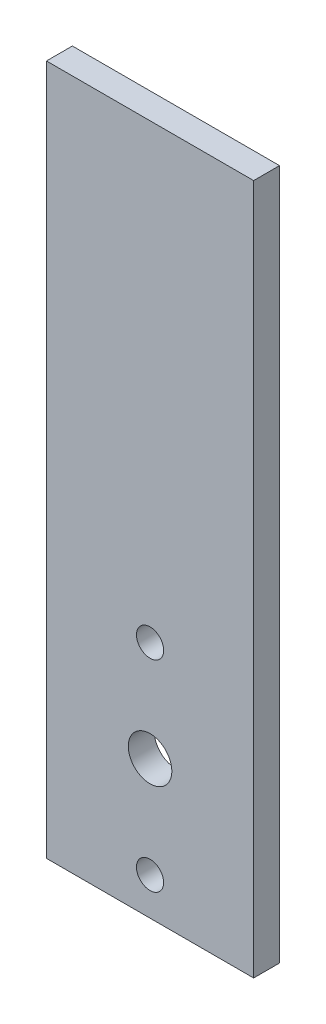
ISO-10303-21;
HEADER;
FILE_DESCRIPTION(('STEP AP214'),'2;1');
FILE_NAME('part.step','',(''),(''),'','','');
FILE_SCHEMA(('AUTOMOTIVE_DESIGN { 1 0 10303 214 1 1 1 1 }'));
ENDSEC;
DATA;
#1=APPLICATION_CONTEXT('core data for automotive mechanical design processes');
#2=APPLICATION_PROTOCOL_DEFINITION('international standard','automotive_design',2000,#1);
#3=PRODUCT_CONTEXT('',#1,'mechanical');
#4=PRODUCT('Part','Part','',(#3));
#5=PRODUCT_RELATED_PRODUCT_CATEGORY('part','',(#4));
#6=PRODUCT_DEFINITION_FORMATION('','',#4);
#7=PRODUCT_DEFINITION_CONTEXT('part definition',#1,'design');
#8=PRODUCT_DEFINITION('design','',#6,#7);
#9=PRODUCT_DEFINITION_SHAPE('','',#8);
#10=(LENGTH_UNIT() NAMED_UNIT(*) SI_UNIT(.MILLI.,.METRE.));
#11=(NAMED_UNIT(*) PLANE_ANGLE_UNIT() SI_UNIT($,.RADIAN.));
#12=(NAMED_UNIT(*) SI_UNIT($,.STERADIAN.) SOLID_ANGLE_UNIT());
#13=UNCERTAINTY_MEASURE_WITH_UNIT(LENGTH_MEASURE(1.E-05),#10,'distance_accuracy_value','');
#14=(GEOMETRIC_REPRESENTATION_CONTEXT(3) GLOBAL_UNCERTAINTY_ASSIGNED_CONTEXT((#13)) GLOBAL_UNIT_ASSIGNED_CONTEXT((#10,
#11,#12)) REPRESENTATION_CONTEXT('',''));
#15=CARTESIAN_POINT('',(0.,0.,0.));
#16=DIRECTION('',(0.,0.,1.));
#17=DIRECTION('',(1.,0.,0.));
#18=AXIS2_PLACEMENT_3D('',#15,#16,#17);
#19=CARTESIAN_POINT('',(0.,0.,4.7625));
#20=DIRECTION('',(0.,0.,-1.));
#21=DIRECTION('',(-1.,0.,0.));
#22=AXIS2_PLACEMENT_3D('',#19,#20,#21);
#23=PLANE('',#22);
#24=DIRECTION('',(0.,-1.,0.));
#25=VECTOR('',#24,1.);
#26=CARTESIAN_POINT('',(0.,0.,4.7625));
#27=LINE('',#26,#25);
#28=CARTESIAN_POINT('',(0.,127.,4.7625));
#29=VERTEX_POINT('',#28);
#30=CARTESIAN_POINT('',(0.,0.,4.7625));
#31=VERTEX_POINT('',#30);
#32=EDGE_CURVE('E96',#29,#31,#27,.T.);
#33=ORIENTED_EDGE('',*,*,#32,.T.);
#34=DIRECTION('',(1.,0.,0.));
#35=VECTOR('',#34,1.);
#36=CARTESIAN_POINT('',(0.,0.,4.7625));
#37=LINE('',#36,#35);
#38=CARTESIAN_POINT('',(38.1,0.,4.7625));
#39=VERTEX_POINT('',#38);
#40=EDGE_CURVE('E91',#31,#39,#37,.T.);
#41=ORIENTED_EDGE('',*,*,#40,.T.);
#42=DIRECTION('',(0.,1.,0.));
#43=VECTOR('',#42,1.);
#44=CARTESIAN_POINT('',(38.1,0.,4.7625));
#45=LINE('',#44,#43);
#46=CARTESIAN_POINT('',(38.1,127.,4.7625));
#47=VERTEX_POINT('',#46);
#48=EDGE_CURVE('E94',#39,#47,#45,.T.);
#49=ORIENTED_EDGE('',*,*,#48,.T.);
#50=DIRECTION('',(-1.,0.,0.));
#51=VECTOR('',#50,1.);
#52=CARTESIAN_POINT('',(0.,127.,4.7625));
#53=LINE('',#52,#51);
#54=EDGE_CURVE('E61',#47,#29,#53,.T.);
#55=ORIENTED_EDGE('',*,*,#54,.T.);
#56=EDGE_LOOP('',(#33,#41,#49,#55));
#57=FACE_BOUND('',#56,.T.);
#58=CARTESIAN_POINT('',(19.05,25.4,4.7625));
#59=DIRECTION('',(0.,0.,1.));
#60=DIRECTION('',(1.,0.,0.));
#61=AXIS2_PLACEMENT_3D('',#58,#59,#60);
#62=CIRCLE('',#61,4.);
#63=CARTESIAN_POINT('',(15.05,25.4,4.7625));
#64=VERTEX_POINT('',#63);
#65=EDGE_CURVE('E116',#64,#64,#62,.T.);
#66=ORIENTED_EDGE('',*,*,#65,.F.);
#67=EDGE_LOOP('',(#66));
#68=FACE_BOUND('',#67,.T.);
#69=CARTESIAN_POINT('',(19.05,6.9,4.7625));
#70=DIRECTION('',(0.,0.,1.));
#71=DIRECTION('',(1.,0.,0.));
#72=AXIS2_PLACEMENT_3D('',#69,#70,#71);
#73=CIRCLE('',#72,2.5);
#74=CARTESIAN_POINT('',(16.55,6.9,4.7625));
#75=VERTEX_POINT('',#74);
#76=EDGE_CURVE('E138',#75,#75,#73,.T.);
#77=ORIENTED_EDGE('',*,*,#76,.F.);
#78=EDGE_LOOP('',(#77));
#79=FACE_BOUND('',#78,.T.);
#80=CARTESIAN_POINT('',(19.05,43.9,4.7625));
#81=DIRECTION('',(0.,0.,1.));
#82=DIRECTION('',(1.,0.,0.));
#83=AXIS2_PLACEMENT_3D('',#80,#81,#82);
#84=CIRCLE('',#83,2.5);
#85=CARTESIAN_POINT('',(16.55,43.9,4.7625));
#86=VERTEX_POINT('',#85);
#87=EDGE_CURVE('E146',#86,#86,#84,.T.);
#88=ORIENTED_EDGE('',*,*,#87,.F.);
#89=EDGE_LOOP('',(#88));
#90=FACE_BOUND('',#89,.T.);
#91=ADVANCED_FACE('F43',(#57,#68,#79,#90),#23,.F.);
#92=CARTESIAN_POINT('',(0.,0.,0.));
#93=DIRECTION('',(0.,0.,-1.));
#94=DIRECTION('',(-1.,0.,0.));
#95=AXIS2_PLACEMENT_3D('',#92,#93,#94);
#96=PLANE('',#95);
#97=CARTESIAN_POINT('',(19.05,6.9,0.));
#98=DIRECTION('',(0.,0.,1.));
#99=DIRECTION('',(1.,0.,0.));
#100=AXIS2_PLACEMENT_3D('',#97,#98,#99);
#101=CIRCLE('',#100,2.5);
#102=CARTESIAN_POINT('',(16.55,6.9,0.));
#103=VERTEX_POINT('',#102);
#104=EDGE_CURVE('E142',#103,#103,#101,.T.);
#105=ORIENTED_EDGE('',*,*,#104,.T.);
#106=EDGE_LOOP('',(#105));
#107=FACE_BOUND('',#106,.T.);
#108=DIRECTION('',(0.,-1.,0.));
#109=VECTOR('',#108,1.);
#110=CARTESIAN_POINT('',(0.,0.,0.));
#111=LINE('',#110,#109);
#112=CARTESIAN_POINT('',(0.,127.,0.));
#113=VERTEX_POINT('',#112);
#114=CARTESIAN_POINT('',(0.,0.,0.));
#115=VERTEX_POINT('',#114);
#116=EDGE_CURVE('E112',#113,#115,#111,.T.);
#117=ORIENTED_EDGE('',*,*,#116,.F.);
#118=DIRECTION('',(-1.,0.,0.));
#119=VECTOR('',#118,1.);
#120=CARTESIAN_POINT('',(0.,127.,0.));
#121=LINE('',#120,#119);
#122=CARTESIAN_POINT('',(38.1,127.,0.));
#123=VERTEX_POINT('',#122);
#124=EDGE_CURVE('E84',#123,#113,#121,.T.);
#125=ORIENTED_EDGE('',*,*,#124,.F.);
#126=DIRECTION('',(0.,1.,0.));
#127=VECTOR('',#126,1.);
#128=CARTESIAN_POINT('',(38.1,0.,0.));
#129=LINE('',#128,#127);
#130=CARTESIAN_POINT('',(38.1,0.,0.));
#131=VERTEX_POINT('',#130);
#132=EDGE_CURVE('E78',#131,#123,#129,.T.);
#133=ORIENTED_EDGE('',*,*,#132,.F.);
#134=DIRECTION('',(1.,0.,0.));
#135=VECTOR('',#134,1.);
#136=CARTESIAN_POINT('',(0.,0.,0.));
#137=LINE('',#136,#135);
#138=EDGE_CURVE('E101',#115,#131,#137,.T.);
#139=ORIENTED_EDGE('',*,*,#138,.F.);
#140=EDGE_LOOP('',(#117,#125,#133,#139));
#141=FACE_BOUND('',#140,.T.);
#142=CARTESIAN_POINT('',(19.05,25.4,0.));
#143=DIRECTION('',(0.,0.,1.));
#144=DIRECTION('',(1.,0.,0.));
#145=AXIS2_PLACEMENT_3D('',#142,#143,#144);
#146=CIRCLE('',#145,4.);
#147=CARTESIAN_POINT('',(15.05,25.4,0.));
#148=VERTEX_POINT('',#147);
#149=EDGE_CURVE('E134',#148,#148,#146,.T.);
#150=ORIENTED_EDGE('',*,*,#149,.T.);
#151=EDGE_LOOP('',(#150));
#152=FACE_BOUND('',#151,.T.);
#153=CARTESIAN_POINT('',(19.05,43.9,0.));
#154=DIRECTION('',(0.,0.,1.));
#155=DIRECTION('',(1.,0.,0.));
#156=AXIS2_PLACEMENT_3D('',#153,#154,#155);
#157=CIRCLE('',#156,2.5);
#158=CARTESIAN_POINT('',(16.55,43.9,0.));
#159=VERTEX_POINT('',#158);
#160=EDGE_CURVE('E150',#159,#159,#157,.T.);
#161=ORIENTED_EDGE('',*,*,#160,.T.);
#162=EDGE_LOOP('',(#161));
#163=FACE_BOUND('',#162,.T.);
#164=ADVANCED_FACE('F129',(#107,#141,#152,#163),#96,.T.);
#165=CARTESIAN_POINT('',(0.,0.,4.7625));
#166=DIRECTION('',(1.,0.,0.));
#167=DIRECTION('',(0.,0.,-1.));
#168=AXIS2_PLACEMENT_3D('',#165,#166,#167);
#169=PLANE('',#168);
#170=ORIENTED_EDGE('',*,*,#116,.T.);
#171=DIRECTION('',(0.,0.,-1.));
#172=VECTOR('',#171,1.);
#173=CARTESIAN_POINT('',(0.,0.,4.7625));
#174=LINE('',#173,#172);
#175=EDGE_CURVE('E11',#31,#115,#174,.T.);
#176=ORIENTED_EDGE('',*,*,#175,.F.);
#177=ORIENTED_EDGE('',*,*,#32,.F.);
#178=DIRECTION('',(0.,0.,-1.));
#179=VECTOR('',#178,1.);
#180=CARTESIAN_POINT('',(0.,127.,4.7625));
#181=LINE('',#180,#179);
#182=EDGE_CURVE('E108',#29,#113,#181,.T.);
#183=ORIENTED_EDGE('',*,*,#182,.T.);
#184=EDGE_LOOP('',(#170,#176,#177,#183));
#185=FACE_BOUND('',#184,.T.);
#186=ADVANCED_FACE('F45',(#185),#169,.F.);
#187=CARTESIAN_POINT('',(0.,0.,4.7625));
#188=DIRECTION('',(0.,1.,0.));
#189=DIRECTION('',(0.,0.,1.));
#190=AXIS2_PLACEMENT_3D('',#187,#188,#189);
#191=PLANE('',#190);
#192=ORIENTED_EDGE('',*,*,#138,.T.);
#193=DIRECTION('',(0.,0.,-1.));
#194=VECTOR('',#193,1.);
#195=CARTESIAN_POINT('',(38.1,0.,4.7625));
#196=LINE('',#195,#194);
#197=EDGE_CURVE('E53',#39,#131,#196,.T.);
#198=ORIENTED_EDGE('',*,*,#197,.F.);
#199=ORIENTED_EDGE('',*,*,#40,.F.);
#200=ORIENTED_EDGE('',*,*,#175,.T.);
#201=EDGE_LOOP('',(#192,#198,#199,#200));
#202=FACE_BOUND('',#201,.T.);
#203=ADVANCED_FACE('F100',(#202),#191,.F.);
#204=CARTESIAN_POINT('',(38.1,0.,4.7625));
#205=DIRECTION('',(-1.,0.,0.));
#206=DIRECTION('',(0.,0.,1.));
#207=AXIS2_PLACEMENT_3D('',#204,#205,#206);
#208=PLANE('',#207);
#209=ORIENTED_EDGE('',*,*,#132,.T.);
#210=DIRECTION('',(0.,0.,-1.));
#211=VECTOR('',#210,1.);
#212=CARTESIAN_POINT('',(38.1,127.,4.7625));
#213=LINE('',#212,#211);
#214=EDGE_CURVE('E103',#47,#123,#213,.T.);
#215=ORIENTED_EDGE('',*,*,#214,.F.);
#216=ORIENTED_EDGE('',*,*,#48,.F.);
#217=ORIENTED_EDGE('',*,*,#197,.T.);
#218=EDGE_LOOP('',(#209,#215,#216,#217));
#219=FACE_BOUND('',#218,.T.);
#220=ADVANCED_FACE('F104',(#219),#208,.F.);
#221=CARTESIAN_POINT('',(0.,127.,4.7625));
#222=DIRECTION('',(0.,-1.,0.));
#223=DIRECTION('',(0.,0.,-1.));
#224=AXIS2_PLACEMENT_3D('',#221,#222,#223);
#225=PLANE('',#224);
#226=ORIENTED_EDGE('',*,*,#124,.T.);
#227=ORIENTED_EDGE('',*,*,#182,.F.);
#228=ORIENTED_EDGE('',*,*,#54,.F.);
#229=ORIENTED_EDGE('',*,*,#214,.T.);
#230=EDGE_LOOP('',(#226,#227,#228,#229));
#231=FACE_BOUND('',#230,.T.);
#232=ADVANCED_FACE('F126',(#231),#225,.F.);
#233=CARTESIAN_POINT('',(19.05,25.4,4.7625));
#234=DIRECTION('',(0.,0.,-1.));
#235=DIRECTION('',(-1.,0.,0.));
#236=AXIS2_PLACEMENT_3D('',#233,#234,#235);
#237=CYLINDRICAL_SURFACE('',#236,4.);
#238=CARTESIAN_POINT('',(15.05,25.4,4.7625));
#239=CARTESIAN_POINT('',(15.05,25.4,4.712890625));
#240=CARTESIAN_POINT('',(15.05,25.4,4.66328125));
#241=CARTESIAN_POINT('',(15.05,25.4,4.5640625));
#242=CARTESIAN_POINT('',(15.05,25.4,4.514453125));
#243=CARTESIAN_POINT('',(15.05,25.4,4.415234375));
#244=CARTESIAN_POINT('',(15.05,25.4,4.365625));
#245=CARTESIAN_POINT('',(15.05,25.4,4.26640625));
#246=CARTESIAN_POINT('',(15.05,25.4,4.216796875));
#247=CARTESIAN_POINT('',(15.05,25.4,4.117578125));
#248=CARTESIAN_POINT('',(15.05,25.4,4.06796875));
#249=CARTESIAN_POINT('',(15.05,25.4,3.96875));
#250=CARTESIAN_POINT('',(15.05,25.4,3.919140625));
#251=CARTESIAN_POINT('',(15.05,25.4,3.819921875));
#252=CARTESIAN_POINT('',(15.05,25.4,3.7703125));
#253=CARTESIAN_POINT('',(15.05,25.4,3.67109375));
#254=CARTESIAN_POINT('',(15.05,25.4,3.621484375));
#255=CARTESIAN_POINT('',(15.05,25.4,3.522265625));
#256=CARTESIAN_POINT('',(15.05,25.4,3.47265625));
#257=CARTESIAN_POINT('',(15.05,25.4,3.3734375));
#258=CARTESIAN_POINT('',(15.05,25.4,3.323828125));
#259=CARTESIAN_POINT('',(15.05,25.4,3.224609375));
#260=CARTESIAN_POINT('',(15.05,25.4,3.175));
#261=CARTESIAN_POINT('',(15.05,25.4,3.07578125));
#262=CARTESIAN_POINT('',(15.05,25.4,3.026171875));
#263=CARTESIAN_POINT('',(15.05,25.4,2.926953125));
#264=CARTESIAN_POINT('',(15.05,25.4,2.87734375));
#265=CARTESIAN_POINT('',(15.05,25.4,2.778125));
#266=CARTESIAN_POINT('',(15.05,25.4,2.728515625));
#267=CARTESIAN_POINT('',(15.05,25.4,2.629296875));
#268=CARTESIAN_POINT('',(15.05,25.4,2.5796875));
#269=CARTESIAN_POINT('',(15.05,25.4,2.48046875));
#270=CARTESIAN_POINT('',(15.05,25.4,2.430859375));
#271=CARTESIAN_POINT('',(15.05,25.4,2.331640625));
#272=CARTESIAN_POINT('',(15.05,25.4,2.28203125));
#273=CARTESIAN_POINT('',(15.05,25.4,2.1828125));
#274=CARTESIAN_POINT('',(15.05,25.4,2.133203125));
#275=CARTESIAN_POINT('',(15.05,25.4,2.033984375));
#276=CARTESIAN_POINT('',(15.05,25.4,1.984375));
#277=CARTESIAN_POINT('',(15.05,25.4,1.88515625));
#278=CARTESIAN_POINT('',(15.05,25.4,1.835546875));
#279=CARTESIAN_POINT('',(15.05,25.4,1.736328125));
#280=CARTESIAN_POINT('',(15.05,25.4,1.68671875));
#281=CARTESIAN_POINT('',(15.05,25.4,1.5875));
#282=CARTESIAN_POINT('',(15.05,25.4,1.537890625));
#283=CARTESIAN_POINT('',(15.05,25.4,1.438671875));
#284=CARTESIAN_POINT('',(15.05,25.4,1.3890625));
#285=CARTESIAN_POINT('',(15.05,25.4,1.28984375));
#286=CARTESIAN_POINT('',(15.05,25.4,1.240234375));
#287=CARTESIAN_POINT('',(15.05,25.4,1.141015625));
#288=CARTESIAN_POINT('',(15.05,25.4,1.09140625));
#289=CARTESIAN_POINT('',(15.05,25.4,0.992187499999999));
#290=CARTESIAN_POINT('',(15.05,25.4,0.942578124999999));
#291=CARTESIAN_POINT('',(15.05,25.4,0.843359375));
#292=CARTESIAN_POINT('',(15.05,25.4,0.79375));
#293=CARTESIAN_POINT('',(15.05,25.4,0.69453125));
#294=CARTESIAN_POINT('',(15.05,25.4,0.644921875));
#295=CARTESIAN_POINT('',(15.05,25.4,0.545703125));
#296=CARTESIAN_POINT('',(15.05,25.4,0.49609375));
#297=CARTESIAN_POINT('',(15.05,25.4,0.396875));
#298=CARTESIAN_POINT('',(15.05,25.4,0.347265625));
#299=CARTESIAN_POINT('',(15.05,25.4,0.248046875));
#300=CARTESIAN_POINT('',(15.05,25.4,0.1984375));
#301=CARTESIAN_POINT('',(15.05,25.4,0.09921875));
#302=CARTESIAN_POINT('',(15.05,25.4,0.049609375));
#303=CARTESIAN_POINT('',(15.05,25.4,0.));
#304=B_SPLINE_CURVE_WITH_KNOTS('',3,(#238,#239,#240,#241,#242,#243,#244,#245,#246,#247,#248,
#249,#250,#251,#252,#253,#254,#255,#256,#257,#258,#259,#260,#261,#262,#263,#264,#265,#266,#267,
#268,#269,#270,#271,#272,#273,#274,#275,#276,#277,#278,#279,#280,#281,#282,#283,#284,#285,#286,
#287,#288,#289,#290,#291,#292,#293,#294,#295,#296,#297,#298,#299,#300,#301,#302,#303),
.UNSPECIFIED.,.F.,.F.,(4,2,2,2,2,2,2,2,2,2,2,2,2,2,2,2,2,2,2,2,2,2,2,2,2,2,2,2,2,2,2,2,4),(0.,
0.148828125,0.29765625,0.446484375,0.5953125,0.744140625,0.892968750000001,1.041796875,1.190625,
1.339453125,1.48828125,1.637109375,1.7859375,1.934765625,2.08359375,2.232421875,2.38125,
2.530078125,2.67890625,2.827734375,2.9765625,3.125390625,3.27421875,3.423046875,3.571875,
3.720703125,3.86953125,4.018359375,4.1671875,4.316015625,4.46484375,4.613671875,4.7625),.UNSPECIFIED.);
#305=EDGE_CURVE('BSEAM169',#64,#148,#304,.T.);
#306=ORIENTED_EDGE('',*,*,#65,.T.);
#307=ORIENTED_EDGE('',*,*,#149,.F.);
#308=ORIENTED_EDGE('',*,*,#305,.T.);
#309=ORIENTED_EDGE('',*,*,#305,.F.);
#310=EDGE_LOOP('',(#306,#308,#307,#309));
#311=FACE_BOUND('',#310,.T.);
#312=ADVANCED_FACE('F169',(#311),#237,.F.);
#313=CARTESIAN_POINT('',(19.05,6.9,4.7625));
#314=DIRECTION('',(0.,0.,-1.));
#315=DIRECTION('',(-1.,0.,0.));
#316=AXIS2_PLACEMENT_3D('',#313,#314,#315);
#317=CYLINDRICAL_SURFACE('',#316,2.5);
#318=CARTESIAN_POINT('',(16.55,6.9,4.7625));
#319=CARTESIAN_POINT('',(16.55,6.9,4.712890625));
#320=CARTESIAN_POINT('',(16.55,6.9,4.66328125));
#321=CARTESIAN_POINT('',(16.55,6.9,4.5640625));
#322=CARTESIAN_POINT('',(16.55,6.9,4.514453125));
#323=CARTESIAN_POINT('',(16.55,6.9,4.415234375));
#324=CARTESIAN_POINT('',(16.55,6.9,4.365625));
#325=CARTESIAN_POINT('',(16.55,6.9,4.26640625));
#326=CARTESIAN_POINT('',(16.55,6.9,4.216796875));
#327=CARTESIAN_POINT('',(16.55,6.9,4.117578125));
#328=CARTESIAN_POINT('',(16.55,6.9,4.06796875));
#329=CARTESIAN_POINT('',(16.55,6.9,3.96875));
#330=CARTESIAN_POINT('',(16.55,6.9,3.919140625));
#331=CARTESIAN_POINT('',(16.55,6.9,3.819921875));
#332=CARTESIAN_POINT('',(16.55,6.9,3.7703125));
#333=CARTESIAN_POINT('',(16.55,6.9,3.67109375));
#334=CARTESIAN_POINT('',(16.55,6.9,3.621484375));
#335=CARTESIAN_POINT('',(16.55,6.9,3.522265625));
#336=CARTESIAN_POINT('',(16.55,6.9,3.47265625));
#337=CARTESIAN_POINT('',(16.55,6.9,3.3734375));
#338=CARTESIAN_POINT('',(16.55,6.9,3.323828125));
#339=CARTESIAN_POINT('',(16.55,6.9,3.224609375));
#340=CARTESIAN_POINT('',(16.55,6.9,3.175));
#341=CARTESIAN_POINT('',(16.55,6.9,3.07578125));
#342=CARTESIAN_POINT('',(16.55,6.9,3.026171875));
#343=CARTESIAN_POINT('',(16.55,6.9,2.926953125));
#344=CARTESIAN_POINT('',(16.55,6.9,2.87734375));
#345=CARTESIAN_POINT('',(16.55,6.9,2.778125));
#346=CARTESIAN_POINT('',(16.55,6.9,2.728515625));
#347=CARTESIAN_POINT('',(16.55,6.9,2.629296875));
#348=CARTESIAN_POINT('',(16.55,6.9,2.5796875));
#349=CARTESIAN_POINT('',(16.55,6.9,2.48046875));
#350=CARTESIAN_POINT('',(16.55,6.9,2.430859375));
#351=CARTESIAN_POINT('',(16.55,6.9,2.331640625));
#352=CARTESIAN_POINT('',(16.55,6.9,2.28203125));
#353=CARTESIAN_POINT('',(16.55,6.9,2.1828125));
#354=CARTESIAN_POINT('',(16.55,6.9,2.133203125));
#355=CARTESIAN_POINT('',(16.55,6.9,2.033984375));
#356=CARTESIAN_POINT('',(16.55,6.9,1.984375));
#357=CARTESIAN_POINT('',(16.55,6.9,1.88515625));
#358=CARTESIAN_POINT('',(16.55,6.9,1.835546875));
#359=CARTESIAN_POINT('',(16.55,6.9,1.736328125));
#360=CARTESIAN_POINT('',(16.55,6.9,1.68671875));
#361=CARTESIAN_POINT('',(16.55,6.9,1.5875));
#362=CARTESIAN_POINT('',(16.55,6.9,1.537890625));
#363=CARTESIAN_POINT('',(16.55,6.9,1.438671875));
#364=CARTESIAN_POINT('',(16.55,6.9,1.3890625));
#365=CARTESIAN_POINT('',(16.55,6.9,1.28984375));
#366=CARTESIAN_POINT('',(16.55,6.9,1.240234375));
#367=CARTESIAN_POINT('',(16.55,6.9,1.141015625));
#368=CARTESIAN_POINT('',(16.55,6.9,1.09140625));
#369=CARTESIAN_POINT('',(16.55,6.9,0.992187499999999));
#370=CARTESIAN_POINT('',(16.55,6.9,0.942578124999999));
#371=CARTESIAN_POINT('',(16.55,6.9,0.843359375));
#372=CARTESIAN_POINT('',(16.55,6.9,0.79375));
#373=CARTESIAN_POINT('',(16.55,6.9,0.69453125));
#374=CARTESIAN_POINT('',(16.55,6.9,0.644921875));
#375=CARTESIAN_POINT('',(16.55,6.9,0.545703125));
#376=CARTESIAN_POINT('',(16.55,6.9,0.49609375));
#377=CARTESIAN_POINT('',(16.55,6.9,0.396875));
#378=CARTESIAN_POINT('',(16.55,6.9,0.347265625));
#379=CARTESIAN_POINT('',(16.55,6.9,0.248046875));
#380=CARTESIAN_POINT('',(16.55,6.9,0.1984375));
#381=CARTESIAN_POINT('',(16.55,6.9,0.09921875));
#382=CARTESIAN_POINT('',(16.55,6.9,0.049609375));
#383=CARTESIAN_POINT('',(16.55,6.9,0.));
#384=B_SPLINE_CURVE_WITH_KNOTS('',3,(#318,#319,#320,#321,#322,#323,#324,#325,#326,#327,#328,
#329,#330,#331,#332,#333,#334,#335,#336,#337,#338,#339,#340,#341,#342,#343,#344,#345,#346,#347,
#348,#349,#350,#351,#352,#353,#354,#355,#356,#357,#358,#359,#360,#361,#362,#363,#364,#365,#366,
#367,#368,#369,#370,#371,#372,#373,#374,#375,#376,#377,#378,#379,#380,#381,#382,#383),
.UNSPECIFIED.,.F.,.F.,(4,2,2,2,2,2,2,2,2,2,2,2,2,2,2,2,2,2,2,2,2,2,2,2,2,2,2,2,2,2,2,2,4),(0.,
0.148828125,0.29765625,0.446484375,0.5953125,0.744140625,0.892968750000001,1.041796875,1.190625,
1.339453125,1.48828125,1.637109375,1.7859375,1.934765625,2.08359375,2.232421875,2.38125,
2.530078125,2.67890625,2.827734375,2.9765625,3.125390625,3.27421875,3.423046875,3.571875,
3.720703125,3.86953125,4.018359375,4.1671875,4.316015625,4.46484375,4.613671875,4.7625),.UNSPECIFIED.);
#385=EDGE_CURVE('BSEAM223',#75,#103,#384,.T.);
#386=ORIENTED_EDGE('',*,*,#76,.T.);
#387=ORIENTED_EDGE('',*,*,#104,.F.);
#388=ORIENTED_EDGE('',*,*,#385,.T.);
#389=ORIENTED_EDGE('',*,*,#385,.F.);
#390=EDGE_LOOP('',(#386,#388,#387,#389));
#391=FACE_BOUND('',#390,.T.);
#392=ADVANCED_FACE('F223',(#391),#317,.F.);
#393=CARTESIAN_POINT('',(19.05,43.9,4.7625));
#394=DIRECTION('',(0.,0.,-1.));
#395=DIRECTION('',(-1.,0.,0.));
#396=AXIS2_PLACEMENT_3D('',#393,#394,#395);
#397=CYLINDRICAL_SURFACE('',#396,2.5);
#398=CARTESIAN_POINT('',(16.55,43.9,4.7625));
#399=CARTESIAN_POINT('',(16.55,43.9,4.712890625));
#400=CARTESIAN_POINT('',(16.55,43.9,4.66328125));
#401=CARTESIAN_POINT('',(16.55,43.9,4.5640625));
#402=CARTESIAN_POINT('',(16.55,43.9,4.514453125));
#403=CARTESIAN_POINT('',(16.55,43.9,4.415234375));
#404=CARTESIAN_POINT('',(16.55,43.9,4.365625));
#405=CARTESIAN_POINT('',(16.55,43.9,4.26640625));
#406=CARTESIAN_POINT('',(16.55,43.9,4.216796875));
#407=CARTESIAN_POINT('',(16.55,43.9,4.117578125));
#408=CARTESIAN_POINT('',(16.55,43.9,4.06796875));
#409=CARTESIAN_POINT('',(16.55,43.9,3.96875));
#410=CARTESIAN_POINT('',(16.55,43.9,3.919140625));
#411=CARTESIAN_POINT('',(16.55,43.9,3.819921875));
#412=CARTESIAN_POINT('',(16.55,43.9,3.7703125));
#413=CARTESIAN_POINT('',(16.55,43.9,3.67109375));
#414=CARTESIAN_POINT('',(16.55,43.9,3.621484375));
#415=CARTESIAN_POINT('',(16.55,43.9,3.522265625));
#416=CARTESIAN_POINT('',(16.55,43.9,3.47265625));
#417=CARTESIAN_POINT('',(16.55,43.9,3.3734375));
#418=CARTESIAN_POINT('',(16.55,43.9,3.323828125));
#419=CARTESIAN_POINT('',(16.55,43.9,3.224609375));
#420=CARTESIAN_POINT('',(16.55,43.9,3.175));
#421=CARTESIAN_POINT('',(16.55,43.9,3.07578125));
#422=CARTESIAN_POINT('',(16.55,43.9,3.026171875));
#423=CARTESIAN_POINT('',(16.55,43.9,2.926953125));
#424=CARTESIAN_POINT('',(16.55,43.9,2.87734375));
#425=CARTESIAN_POINT('',(16.55,43.9,2.778125));
#426=CARTESIAN_POINT('',(16.55,43.9,2.728515625));
#427=CARTESIAN_POINT('',(16.55,43.9,2.629296875));
#428=CARTESIAN_POINT('',(16.55,43.9,2.5796875));
#429=CARTESIAN_POINT('',(16.55,43.9,2.48046875));
#430=CARTESIAN_POINT('',(16.55,43.9,2.430859375));
#431=CARTESIAN_POINT('',(16.55,43.9,2.331640625));
#432=CARTESIAN_POINT('',(16.55,43.9,2.28203125));
#433=CARTESIAN_POINT('',(16.55,43.9,2.1828125));
#434=CARTESIAN_POINT('',(16.55,43.9,2.133203125));
#435=CARTESIAN_POINT('',(16.55,43.9,2.033984375));
#436=CARTESIAN_POINT('',(16.55,43.9,1.984375));
#437=CARTESIAN_POINT('',(16.55,43.9,1.88515625));
#438=CARTESIAN_POINT('',(16.55,43.9,1.835546875));
#439=CARTESIAN_POINT('',(16.55,43.9,1.736328125));
#440=CARTESIAN_POINT('',(16.55,43.9,1.68671875));
#441=CARTESIAN_POINT('',(16.55,43.9,1.5875));
#442=CARTESIAN_POINT('',(16.55,43.9,1.537890625));
#443=CARTESIAN_POINT('',(16.55,43.9,1.438671875));
#444=CARTESIAN_POINT('',(16.55,43.9,1.3890625));
#445=CARTESIAN_POINT('',(16.55,43.9,1.28984375));
#446=CARTESIAN_POINT('',(16.55,43.9,1.240234375));
#447=CARTESIAN_POINT('',(16.55,43.9,1.141015625));
#448=CARTESIAN_POINT('',(16.55,43.9,1.09140625));
#449=CARTESIAN_POINT('',(16.55,43.9,0.992187499999999));
#450=CARTESIAN_POINT('',(16.55,43.9,0.942578124999999));
#451=CARTESIAN_POINT('',(16.55,43.9,0.843359375));
#452=CARTESIAN_POINT('',(16.55,43.9,0.79375));
#453=CARTESIAN_POINT('',(16.55,43.9,0.69453125));
#454=CARTESIAN_POINT('',(16.55,43.9,0.644921875));
#455=CARTESIAN_POINT('',(16.55,43.9,0.545703125));
#456=CARTESIAN_POINT('',(16.55,43.9,0.49609375));
#457=CARTESIAN_POINT('',(16.55,43.9,0.396875));
#458=CARTESIAN_POINT('',(16.55,43.9,0.347265625));
#459=CARTESIAN_POINT('',(16.55,43.9,0.248046875));
#460=CARTESIAN_POINT('',(16.55,43.9,0.1984375));
#461=CARTESIAN_POINT('',(16.55,43.9,0.09921875));
#462=CARTESIAN_POINT('',(16.55,43.9,0.049609375));
#463=CARTESIAN_POINT('',(16.55,43.9,0.));
#464=B_SPLINE_CURVE_WITH_KNOTS('',3,(#398,#399,#400,#401,#402,#403,#404,#405,#406,#407,#408,
#409,#410,#411,#412,#413,#414,#415,#416,#417,#418,#419,#420,#421,#422,#423,#424,#425,#426,#427,
#428,#429,#430,#431,#432,#433,#434,#435,#436,#437,#438,#439,#440,#441,#442,#443,#444,#445,#446,
#447,#448,#449,#450,#451,#452,#453,#454,#455,#456,#457,#458,#459,#460,#461,#462,#463),
.UNSPECIFIED.,.F.,.F.,(4,2,2,2,2,2,2,2,2,2,2,2,2,2,2,2,2,2,2,2,2,2,2,2,2,2,2,2,2,2,2,2,4),(0.,
0.148828125,0.29765625,0.446484375,0.5953125,0.744140625,0.892968750000001,1.041796875,1.190625,
1.339453125,1.48828125,1.637109375,1.7859375,1.934765625,2.08359375,2.232421875,2.38125,
2.530078125,2.67890625,2.827734375,2.9765625,3.125390625,3.27421875,3.423046875,3.571875,
3.720703125,3.86953125,4.018359375,4.1671875,4.316015625,4.46484375,4.613671875,4.7625),.UNSPECIFIED.);
#465=EDGE_CURVE('BSEAM158',#86,#159,#464,.T.);
#466=ORIENTED_EDGE('',*,*,#87,.T.);
#467=ORIENTED_EDGE('',*,*,#160,.F.);
#468=ORIENTED_EDGE('',*,*,#465,.T.);
#469=ORIENTED_EDGE('',*,*,#465,.F.);
#470=EDGE_LOOP('',(#466,#468,#467,#469));
#471=FACE_BOUND('',#470,.T.);
#472=ADVANCED_FACE('F158',(#471),#397,.F.);
#473=CLOSED_SHELL('',(#91,#164,#186,#203,#220,#232,#312,#392,#472));
#474=MANIFOLD_SOLID_BREP('B2',#473);
#475=ADVANCED_BREP_SHAPE_REPRESENTATION('',(#18,#474),#14);
#476=SHAPE_DEFINITION_REPRESENTATION(#9,#475);
ENDSEC;
END-ISO-10303-21;
